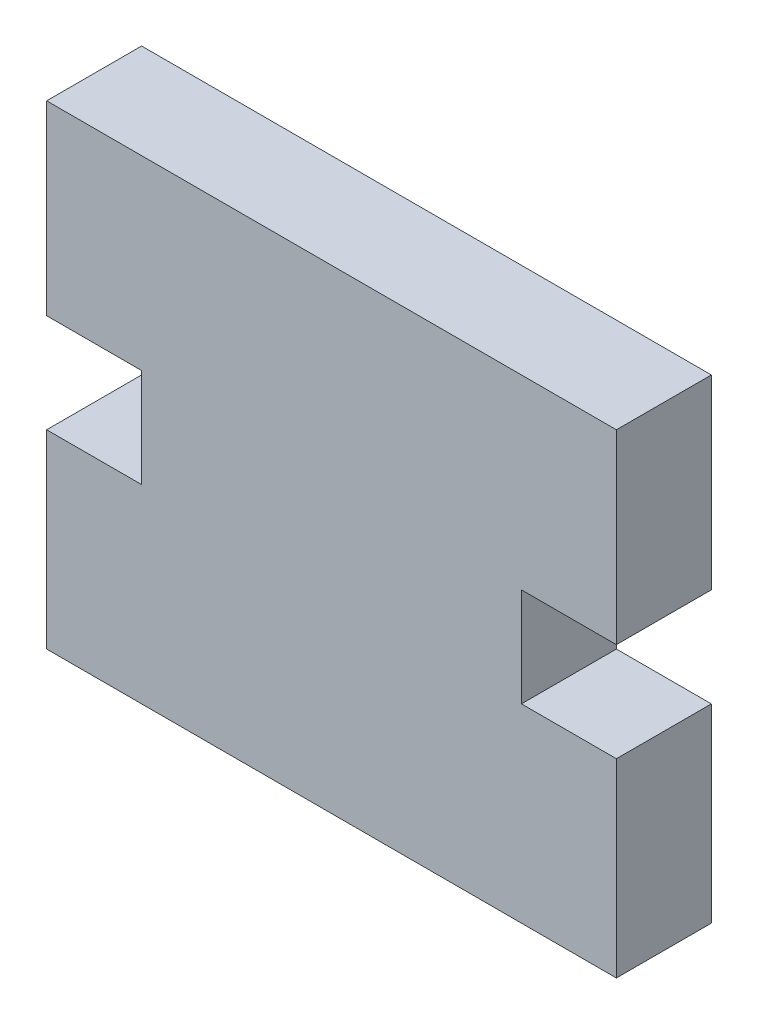
ISO-10303-21;
HEADER;
FILE_DESCRIPTION(('STEP AP214'),'2;1');
FILE_NAME('part.step','',(''),(''),'','','');
FILE_SCHEMA(('AUTOMOTIVE_DESIGN { 1 0 10303 214 1 1 1 1 }'));
ENDSEC;
DATA;
#1=APPLICATION_CONTEXT('core data for automotive mechanical design processes');
#2=APPLICATION_PROTOCOL_DEFINITION('international standard','automotive_design',2000,#1);
#3=PRODUCT_CONTEXT('',#1,'mechanical');
#4=PRODUCT('Part','Part','',(#3));
#5=PRODUCT_RELATED_PRODUCT_CATEGORY('part','',(#4));
#6=PRODUCT_DEFINITION_FORMATION('','',#4);
#7=PRODUCT_DEFINITION_CONTEXT('part definition',#1,'design');
#8=PRODUCT_DEFINITION('design','',#6,#7);
#9=PRODUCT_DEFINITION_SHAPE('','',#8);
#10=(LENGTH_UNIT() NAMED_UNIT(*) SI_UNIT(.MILLI.,.METRE.));
#11=(NAMED_UNIT(*) PLANE_ANGLE_UNIT() SI_UNIT($,.RADIAN.));
#12=(NAMED_UNIT(*) SI_UNIT($,.STERADIAN.) SOLID_ANGLE_UNIT());
#13=UNCERTAINTY_MEASURE_WITH_UNIT(LENGTH_MEASURE(1.E-05),#10,'distance_accuracy_value','');
#14=(GEOMETRIC_REPRESENTATION_CONTEXT(3) GLOBAL_UNCERTAINTY_ASSIGNED_CONTEXT((#13)) GLOBAL_UNIT_ASSIGNED_CONTEXT((#10,
#11,#12)) REPRESENTATION_CONTEXT('',''));
#15=CARTESIAN_POINT('',(0.,0.,0.));
#16=DIRECTION('',(0.,0.,1.));
#17=DIRECTION('',(1.,0.,0.));
#18=AXIS2_PLACEMENT_3D('',#15,#16,#17);
#19=CARTESIAN_POINT('',(-15.,12.5,5.));
#20=DIRECTION('',(1.,0.,0.));
#21=DIRECTION('',(0.,1.,0.));
#22=AXIS2_PLACEMENT_3D('',#19,#20,#21);
#23=PLANE('',#22);
#24=DIRECTION('',(0.,-1.,0.));
#25=VECTOR('',#24,1.);
#26=CARTESIAN_POINT('',(-15.,12.5,0.));
#27=LINE('',#26,#25);
#28=CARTESIAN_POINT('',(-15.,12.5,0.));
#29=VERTEX_POINT('',#28);
#30=CARTESIAN_POINT('',(-15.,2.69999999999998,0.));
#31=VERTEX_POINT('',#30);
#32=EDGE_CURVE('E152',#29,#31,#27,.T.);
#33=ORIENTED_EDGE('',*,*,#32,.T.);
#34=DIRECTION('',(0.,0.,-1.));
#35=VECTOR('',#34,1.);
#36=CARTESIAN_POINT('',(-15.,2.69999999999998,5.));
#37=LINE('',#36,#35);
#38=CARTESIAN_POINT('',(-15.,2.69999999999998,5.));
#39=VERTEX_POINT('',#38);
#40=EDGE_CURVE('E11',#39,#31,#37,.T.);
#41=ORIENTED_EDGE('',*,*,#40,.F.);
#42=DIRECTION('',(0.,-1.,0.));
#43=VECTOR('',#42,1.);
#44=CARTESIAN_POINT('',(-15.,12.5,5.));
#45=LINE('',#44,#43);
#46=CARTESIAN_POINT('',(-15.,12.5,5.));
#47=VERTEX_POINT('',#46);
#48=EDGE_CURVE('E174',#47,#39,#45,.T.);
#49=ORIENTED_EDGE('',*,*,#48,.F.);
#50=DIRECTION('',(0.,0.,-1.));
#51=VECTOR('',#50,1.);
#52=CARTESIAN_POINT('',(-15.,12.5,5.));
#53=LINE('',#52,#51);
#54=EDGE_CURVE('E148',#47,#29,#53,.T.);
#55=ORIENTED_EDGE('',*,*,#54,.T.);
#56=EDGE_LOOP('',(#33,#41,#49,#55));
#57=FACE_BOUND('',#56,.T.);
#58=ADVANCED_FACE('F32',(#57),#23,.F.);
#59=CARTESIAN_POINT('',(-9.99999999999999,2.69999999999998,5.));
#60=DIRECTION('',(0.,1.,0.));
#61=DIRECTION('',(-1.,0.,0.));
#62=AXIS2_PLACEMENT_3D('',#59,#60,#61);
#63=PLANE('',#62);
#64=DIRECTION('',(1.,0.,0.));
#65=VECTOR('',#64,1.);
#66=CARTESIAN_POINT('',(-9.99999999999999,2.69999999999998,0.));
#67=LINE('',#66,#65);
#68=CARTESIAN_POINT('',(-9.99999999999999,2.69999999999998,0.));
#69=VERTEX_POINT('',#68);
#70=EDGE_CURVE('E155',#31,#69,#67,.T.);
#71=ORIENTED_EDGE('',*,*,#70,.T.);
#72=DIRECTION('',(0.,0.,-1.));
#73=VECTOR('',#72,1.);
#74=CARTESIAN_POINT('',(-9.99999999999999,2.69999999999998,5.));
#75=LINE('',#74,#73);
#76=CARTESIAN_POINT('',(-9.99999999999999,2.69999999999998,5.));
#77=VERTEX_POINT('',#76);
#78=EDGE_CURVE('E40',#77,#69,#75,.T.);
#79=ORIENTED_EDGE('',*,*,#78,.F.);
#80=DIRECTION('',(1.,0.,0.));
#81=VECTOR('',#80,1.);
#82=CARTESIAN_POINT('',(-9.99999999999999,2.69999999999998,5.));
#83=LINE('',#82,#81);
#84=EDGE_CURVE('E103',#39,#77,#83,.T.);
#85=ORIENTED_EDGE('',*,*,#84,.F.);
#86=ORIENTED_EDGE('',*,*,#40,.T.);
#87=EDGE_LOOP('',(#71,#79,#85,#86));
#88=FACE_BOUND('',#87,.T.);
#89=ADVANCED_FACE('F252',(#88),#63,.F.);
#90=CARTESIAN_POINT('',(-9.99999999999999,2.69999999999998,5.));
#91=DIRECTION('',(1.,0.,0.));
#92=DIRECTION('',(0.,1.,0.));
#93=AXIS2_PLACEMENT_3D('',#90,#91,#92);
#94=PLANE('',#93);
#95=DIRECTION('',(0.,-1.,0.));
#96=VECTOR('',#95,1.);
#97=CARTESIAN_POINT('',(-9.99999999999999,2.69999999999998,0.));
#98=LINE('',#97,#96);
#99=CARTESIAN_POINT('',(-9.99999999999999,-2.50000000000002,0.));
#100=VERTEX_POINT('',#99);
#101=EDGE_CURVE('E157',#69,#100,#98,.T.);
#102=ORIENTED_EDGE('',*,*,#101,.T.);
#103=DIRECTION('',(0.,0.,-1.));
#104=VECTOR('',#103,1.);
#105=CARTESIAN_POINT('',(-9.99999999999999,-2.50000000000002,5.));
#106=LINE('',#105,#104);
#107=CARTESIAN_POINT('',(-9.99999999999999,-2.50000000000002,5.));
#108=VERTEX_POINT('',#107);
#109=EDGE_CURVE('E193',#108,#100,#106,.T.);
#110=ORIENTED_EDGE('',*,*,#109,.F.);
#111=DIRECTION('',(0.,-1.,0.));
#112=VECTOR('',#111,1.);
#113=CARTESIAN_POINT('',(-9.99999999999999,2.69999999999998,5.));
#114=LINE('',#113,#112);
#115=EDGE_CURVE('E201',#77,#108,#114,.T.);
#116=ORIENTED_EDGE('',*,*,#115,.F.);
#117=ORIENTED_EDGE('',*,*,#78,.T.);
#118=EDGE_LOOP('',(#102,#110,#116,#117));
#119=FACE_BOUND('',#118,.T.);
#120=ADVANCED_FACE('F199',(#119),#94,.F.);
#121=CARTESIAN_POINT('',(-9.99999999999999,-2.50000000000002,5.));
#122=DIRECTION('',(0.,-1.,0.));
#123=DIRECTION('',(1.,0.,0.));
#124=AXIS2_PLACEMENT_3D('',#121,#122,#123);
#125=PLANE('',#124);
#126=DIRECTION('',(-1.,0.,0.));
#127=VECTOR('',#126,1.);
#128=CARTESIAN_POINT('',(-9.99999999999999,-2.50000000000002,0.));
#129=LINE('',#128,#127);
#130=CARTESIAN_POINT('',(-15.,-2.50000000000002,0.));
#131=VERTEX_POINT('',#130);
#132=EDGE_CURVE('E159',#100,#131,#129,.T.);
#133=ORIENTED_EDGE('',*,*,#132,.T.);
#134=DIRECTION('',(0.,0.,-1.));
#135=VECTOR('',#134,1.);
#136=CARTESIAN_POINT('',(-15.,-2.50000000000002,5.));
#137=LINE('',#136,#135);
#138=CARTESIAN_POINT('',(-15.,-2.50000000000002,5.));
#139=VERTEX_POINT('',#138);
#140=EDGE_CURVE('E190',#139,#131,#137,.T.);
#141=ORIENTED_EDGE('',*,*,#140,.F.);
#142=DIRECTION('',(-1.,0.,0.));
#143=VECTOR('',#142,1.);
#144=CARTESIAN_POINT('',(-9.99999999999999,-2.50000000000002,5.));
#145=LINE('',#144,#143);
#146=EDGE_CURVE('E219',#108,#139,#145,.T.);
#147=ORIENTED_EDGE('',*,*,#146,.F.);
#148=ORIENTED_EDGE('',*,*,#109,.T.);
#149=EDGE_LOOP('',(#133,#141,#147,#148));
#150=FACE_BOUND('',#149,.T.);
#151=ADVANCED_FACE('F210',(#150),#125,.F.);
#152=CARTESIAN_POINT('',(-15.,-2.50000000000002,5.));
#153=DIRECTION('',(1.,0.,0.));
#154=DIRECTION('',(0.,1.,0.));
#155=AXIS2_PLACEMENT_3D('',#152,#153,#154);
#156=PLANE('',#155);
#157=DIRECTION('',(0.,-1.,0.));
#158=VECTOR('',#157,1.);
#159=CARTESIAN_POINT('',(-15.,-2.50000000000002,0.));
#160=LINE('',#159,#158);
#161=CARTESIAN_POINT('',(-15.,-12.5,0.));
#162=VERTEX_POINT('',#161);
#163=EDGE_CURVE('E161',#131,#162,#160,.T.);
#164=ORIENTED_EDGE('',*,*,#163,.T.);
#165=DIRECTION('',(0.,0.,-1.));
#166=VECTOR('',#165,1.);
#167=CARTESIAN_POINT('',(-15.,-12.5,5.));
#168=LINE('',#167,#166);
#169=CARTESIAN_POINT('',(-15.,-12.5,5.));
#170=VERTEX_POINT('',#169);
#171=EDGE_CURVE('E187',#170,#162,#168,.T.);
#172=ORIENTED_EDGE('',*,*,#171,.F.);
#173=DIRECTION('',(0.,-1.,0.));
#174=VECTOR('',#173,1.);
#175=CARTESIAN_POINT('',(-15.,-2.50000000000002,5.));
#176=LINE('',#175,#174);
#177=EDGE_CURVE('E216',#139,#170,#176,.T.);
#178=ORIENTED_EDGE('',*,*,#177,.F.);
#179=ORIENTED_EDGE('',*,*,#140,.T.);
#180=EDGE_LOOP('',(#164,#172,#178,#179));
#181=FACE_BOUND('',#180,.T.);
#182=ADVANCED_FACE('F214',(#181),#156,.F.);
#183=CARTESIAN_POINT('',(15.,-12.5,5.));
#184=DIRECTION('',(0.,1.,0.));
#185=DIRECTION('',(-1.,0.,0.));
#186=AXIS2_PLACEMENT_3D('',#183,#184,#185);
#187=PLANE('',#186);
#188=DIRECTION('',(1.,0.,0.));
#189=VECTOR('',#188,1.);
#190=CARTESIAN_POINT('',(15.,-12.5,0.));
#191=LINE('',#190,#189);
#192=CARTESIAN_POINT('',(15.,-12.5,0.));
#193=VERTEX_POINT('',#192);
#194=EDGE_CURVE('E163',#162,#193,#191,.T.);
#195=ORIENTED_EDGE('',*,*,#194,.T.);
#196=DIRECTION('',(0.,0.,-1.));
#197=VECTOR('',#196,1.);
#198=CARTESIAN_POINT('',(15.,-12.5,5.));
#199=LINE('',#198,#197);
#200=CARTESIAN_POINT('',(15.,-12.5,5.));
#201=VERTEX_POINT('',#200);
#202=EDGE_CURVE('E184',#201,#193,#199,.T.);
#203=ORIENTED_EDGE('',*,*,#202,.F.);
#204=DIRECTION('',(1.,0.,0.));
#205=VECTOR('',#204,1.);
#206=CARTESIAN_POINT('',(15.,-12.5,5.));
#207=LINE('',#206,#205);
#208=EDGE_CURVE('E218',#170,#201,#207,.T.);
#209=ORIENTED_EDGE('',*,*,#208,.F.);
#210=ORIENTED_EDGE('',*,*,#171,.T.);
#211=EDGE_LOOP('',(#195,#203,#209,#210));
#212=FACE_BOUND('',#211,.T.);
#213=ADVANCED_FACE('F265',(#212),#187,.F.);
#214=CARTESIAN_POINT('',(15.,-2.50000000000002,5.));
#215=DIRECTION('',(-1.,0.,0.));
#216=DIRECTION('',(0.,-1.,0.));
#217=AXIS2_PLACEMENT_3D('',#214,#215,#216);
#218=PLANE('',#217);
#219=DIRECTION('',(0.,1.,0.));
#220=VECTOR('',#219,1.);
#221=CARTESIAN_POINT('',(15.,-2.50000000000002,0.));
#222=LINE('',#221,#220);
#223=CARTESIAN_POINT('',(15.,-2.50000000000002,0.));
#224=VERTEX_POINT('',#223);
#225=EDGE_CURVE('E165',#193,#224,#222,.T.);
#226=ORIENTED_EDGE('',*,*,#225,.T.);
#227=DIRECTION('',(0.,0.,-1.));
#228=VECTOR('',#227,1.);
#229=CARTESIAN_POINT('',(15.,-2.50000000000002,5.));
#230=LINE('',#229,#228);
#231=CARTESIAN_POINT('',(15.,-2.50000000000002,5.));
#232=VERTEX_POINT('',#231);
#233=EDGE_CURVE('E181',#232,#224,#230,.T.);
#234=ORIENTED_EDGE('',*,*,#233,.F.);
#235=DIRECTION('',(0.,1.,0.));
#236=VECTOR('',#235,1.);
#237=CARTESIAN_POINT('',(15.,-2.50000000000002,5.));
#238=LINE('',#237,#236);
#239=EDGE_CURVE('E221',#201,#232,#238,.T.);
#240=ORIENTED_EDGE('',*,*,#239,.F.);
#241=ORIENTED_EDGE('',*,*,#202,.T.);
#242=EDGE_LOOP('',(#226,#234,#240,#241));
#243=FACE_BOUND('',#242,.T.);
#244=ADVANCED_FACE('F268',(#243),#218,.F.);
#245=CARTESIAN_POINT('',(9.99999999999999,-2.50000000000002,5.));
#246=DIRECTION('',(0.,-1.,0.));
#247=DIRECTION('',(1.,0.,0.));
#248=AXIS2_PLACEMENT_3D('',#245,#246,#247);
#249=PLANE('',#248);
#250=DIRECTION('',(-1.,0.,0.));
#251=VECTOR('',#250,1.);
#252=CARTESIAN_POINT('',(9.99999999999999,-2.50000000000002,0.));
#253=LINE('',#252,#251);
#254=CARTESIAN_POINT('',(9.99999999999999,-2.50000000000002,0.));
#255=VERTEX_POINT('',#254);
#256=EDGE_CURVE('E167',#224,#255,#253,.T.);
#257=ORIENTED_EDGE('',*,*,#256,.T.);
#258=DIRECTION('',(0.,0.,-1.));
#259=VECTOR('',#258,1.);
#260=CARTESIAN_POINT('',(9.99999999999999,-2.50000000000002,5.));
#261=LINE('',#260,#259);
#262=CARTESIAN_POINT('',(9.99999999999999,-2.50000000000002,5.));
#263=VERTEX_POINT('',#262);
#264=EDGE_CURVE('E178',#263,#255,#261,.T.);
#265=ORIENTED_EDGE('',*,*,#264,.F.);
#266=DIRECTION('',(-1.,0.,0.));
#267=VECTOR('',#266,1.);
#268=CARTESIAN_POINT('',(9.99999999999999,-2.50000000000002,5.));
#269=LINE('',#268,#267);
#270=EDGE_CURVE('E227',#232,#263,#269,.T.);
#271=ORIENTED_EDGE('',*,*,#270,.F.);
#272=ORIENTED_EDGE('',*,*,#233,.T.);
#273=EDGE_LOOP('',(#257,#265,#271,#272));
#274=FACE_BOUND('',#273,.T.);
#275=ADVANCED_FACE('F233',(#274),#249,.F.);
#276=CARTESIAN_POINT('',(9.99999999999999,2.69999999999998,5.));
#277=DIRECTION('',(-1.,0.,0.));
#278=DIRECTION('',(0.,0.,1.));
#279=AXIS2_PLACEMENT_3D('',#276,#277,#278);
#280=PLANE('',#279);
#281=DIRECTION('',(0.,1.,0.));
#282=VECTOR('',#281,1.);
#283=CARTESIAN_POINT('',(9.99999999999999,2.69999999999998,0.));
#284=LINE('',#283,#282);
#285=CARTESIAN_POINT('',(9.99999999999999,2.69999999999998,0.));
#286=VERTEX_POINT('',#285);
#287=EDGE_CURVE('E169',#255,#286,#284,.T.);
#288=ORIENTED_EDGE('',*,*,#287,.T.);
#289=DIRECTION('',(0.,0.,-1.));
#290=VECTOR('',#289,1.);
#291=CARTESIAN_POINT('',(9.99999999999999,2.69999999999998,5.));
#292=LINE('',#291,#290);
#293=CARTESIAN_POINT('',(9.99999999999999,2.69999999999998,5.));
#294=VERTEX_POINT('',#293);
#295=EDGE_CURVE('E143',#294,#286,#292,.T.);
#296=ORIENTED_EDGE('',*,*,#295,.F.);
#297=DIRECTION('',(0.,1.,0.));
#298=VECTOR('',#297,1.);
#299=CARTESIAN_POINT('',(9.99999999999999,2.69999999999998,5.));
#300=LINE('',#299,#298);
#301=EDGE_CURVE('E134',#263,#294,#300,.T.);
#302=ORIENTED_EDGE('',*,*,#301,.F.);
#303=ORIENTED_EDGE('',*,*,#264,.T.);
#304=EDGE_LOOP('',(#288,#296,#302,#303));
#305=FACE_BOUND('',#304,.T.);
#306=ADVANCED_FACE('F237',(#305),#280,.F.);
#307=CARTESIAN_POINT('',(9.99999999999999,2.69999999999998,5.));
#308=DIRECTION('',(0.,1.,0.));
#309=DIRECTION('',(-1.,0.,0.));
#310=AXIS2_PLACEMENT_3D('',#307,#308,#309);
#311=PLANE('',#310);
#312=DIRECTION('',(1.,0.,0.));
#313=VECTOR('',#312,1.);
#314=CARTESIAN_POINT('',(9.99999999999999,2.69999999999998,0.));
#315=LINE('',#314,#313);
#316=CARTESIAN_POINT('',(15.,2.69999999999998,0.));
#317=VERTEX_POINT('',#316);
#318=EDGE_CURVE('E142',#286,#317,#315,.T.);
#319=ORIENTED_EDGE('',*,*,#318,.T.);
#320=DIRECTION('',(0.,0.,-1.));
#321=VECTOR('',#320,1.);
#322=CARTESIAN_POINT('',(15.,2.69999999999998,5.));
#323=LINE('',#322,#321);
#324=CARTESIAN_POINT('',(15.,2.69999999999998,5.));
#325=VERTEX_POINT('',#324);
#326=EDGE_CURVE('E139',#325,#317,#323,.T.);
#327=ORIENTED_EDGE('',*,*,#326,.F.);
#328=DIRECTION('',(1.,0.,0.));
#329=VECTOR('',#328,1.);
#330=CARTESIAN_POINT('',(9.99999999999999,2.69999999999998,5.));
#331=LINE('',#330,#329);
#332=EDGE_CURVE('E128',#294,#325,#331,.T.);
#333=ORIENTED_EDGE('',*,*,#332,.F.);
#334=ORIENTED_EDGE('',*,*,#295,.T.);
#335=EDGE_LOOP('',(#319,#327,#333,#334));
#336=FACE_BOUND('',#335,.T.);
#337=ADVANCED_FACE('F140',(#336),#311,.F.);
#338=CARTESIAN_POINT('',(15.,12.5,5.));
#339=DIRECTION('',(-1.,0.,0.));
#340=DIRECTION('',(0.,-1.,0.));
#341=AXIS2_PLACEMENT_3D('',#338,#339,#340);
#342=PLANE('',#341);
#343=DIRECTION('',(0.,1.,0.));
#344=VECTOR('',#343,1.);
#345=CARTESIAN_POINT('',(15.,12.5,0.));
#346=LINE('',#345,#344);
#347=CARTESIAN_POINT('',(15.,12.5,0.));
#348=VERTEX_POINT('',#347);
#349=EDGE_CURVE('E89',#317,#348,#346,.T.);
#350=ORIENTED_EDGE('',*,*,#349,.T.);
#351=DIRECTION('',(0.,0.,-1.));
#352=VECTOR('',#351,1.);
#353=CARTESIAN_POINT('',(15.,12.5,5.));
#354=LINE('',#353,#352);
#355=CARTESIAN_POINT('',(15.,12.5,5.));
#356=VERTEX_POINT('',#355);
#357=EDGE_CURVE('E144',#356,#348,#354,.T.);
#358=ORIENTED_EDGE('',*,*,#357,.F.);
#359=DIRECTION('',(0.,1.,0.));
#360=VECTOR('',#359,1.);
#361=CARTESIAN_POINT('',(15.,12.5,5.));
#362=LINE('',#361,#360);
#363=EDGE_CURVE('E132',#325,#356,#362,.T.);
#364=ORIENTED_EDGE('',*,*,#363,.F.);
#365=ORIENTED_EDGE('',*,*,#326,.T.);
#366=EDGE_LOOP('',(#350,#358,#364,#365));
#367=FACE_BOUND('',#366,.T.);
#368=ADVANCED_FACE('F146',(#367),#342,.F.);
#369=CARTESIAN_POINT('',(15.,12.5,5.));
#370=DIRECTION('',(0.,-1.,0.));
#371=DIRECTION('',(1.,0.,0.));
#372=AXIS2_PLACEMENT_3D('',#369,#370,#371);
#373=PLANE('',#372);
#374=DIRECTION('',(-1.,0.,0.));
#375=VECTOR('',#374,1.);
#376=CARTESIAN_POINT('',(15.,12.5,0.));
#377=LINE('',#376,#375);
#378=EDGE_CURVE('E95',#348,#29,#377,.T.);
#379=ORIENTED_EDGE('',*,*,#378,.T.);
#380=ORIENTED_EDGE('',*,*,#54,.F.);
#381=DIRECTION('',(-1.,0.,0.));
#382=VECTOR('',#381,1.);
#383=CARTESIAN_POINT('',(15.,12.5,5.));
#384=LINE('',#383,#382);
#385=EDGE_CURVE('E48',#356,#47,#384,.T.);
#386=ORIENTED_EDGE('',*,*,#385,.F.);
#387=ORIENTED_EDGE('',*,*,#357,.T.);
#388=EDGE_LOOP('',(#379,#380,#386,#387));
#389=FACE_BOUND('',#388,.T.);
#390=ADVANCED_FACE('F241',(#389),#373,.F.);
#391=CARTESIAN_POINT('',(0.,0.,5.));
#392=DIRECTION('',(0.,0.,-1.));
#393=DIRECTION('',(-1.,0.,0.));
#394=AXIS2_PLACEMENT_3D('',#391,#392,#393);
#395=PLANE('',#394);
#396=ORIENTED_EDGE('',*,*,#48,.T.);
#397=ORIENTED_EDGE('',*,*,#84,.T.);
#398=ORIENTED_EDGE('',*,*,#115,.T.);
#399=ORIENTED_EDGE('',*,*,#146,.T.);
#400=ORIENTED_EDGE('',*,*,#177,.T.);
#401=ORIENTED_EDGE('',*,*,#208,.T.);
#402=ORIENTED_EDGE('',*,*,#239,.T.);
#403=ORIENTED_EDGE('',*,*,#270,.T.);
#404=ORIENTED_EDGE('',*,*,#301,.T.);
#405=ORIENTED_EDGE('',*,*,#332,.T.);
#406=ORIENTED_EDGE('',*,*,#363,.T.);
#407=ORIENTED_EDGE('',*,*,#385,.T.);
#408=EDGE_LOOP('',(#396,#397,#398,#399,#400,#401,#402,#403,#404,#405,#406,#407));
#409=FACE_BOUND('',#408,.T.);
#410=ADVANCED_FACE('F130',(#409),#395,.F.);
#411=CARTESIAN_POINT('',(0.,0.,0.));
#412=DIRECTION('',(0.,0.,-1.));
#413=DIRECTION('',(-1.,0.,0.));
#414=AXIS2_PLACEMENT_3D('',#411,#412,#413);
#415=PLANE('',#414);
#416=ORIENTED_EDGE('',*,*,#32,.F.);
#417=ORIENTED_EDGE('',*,*,#378,.F.);
#418=ORIENTED_EDGE('',*,*,#349,.F.);
#419=ORIENTED_EDGE('',*,*,#318,.F.);
#420=ORIENTED_EDGE('',*,*,#287,.F.);
#421=ORIENTED_EDGE('',*,*,#256,.F.);
#422=ORIENTED_EDGE('',*,*,#225,.F.);
#423=ORIENTED_EDGE('',*,*,#194,.F.);
#424=ORIENTED_EDGE('',*,*,#163,.F.);
#425=ORIENTED_EDGE('',*,*,#132,.F.);
#426=ORIENTED_EDGE('',*,*,#101,.F.);
#427=ORIENTED_EDGE('',*,*,#70,.F.);
#428=EDGE_LOOP('',(#416,#417,#418,#419,#420,#421,#422,#423,#424,#425,#426,#427));
#429=FACE_BOUND('',#428,.T.);
#430=ADVANCED_FACE('F205',(#429),#415,.T.);
#431=CLOSED_SHELL('',(#58,#89,#120,#151,#182,#213,#244,#275,#306,#337,#368,#390,#410,#430));
#432=MANIFOLD_SOLID_BREP('B2',#431);
#433=ADVANCED_BREP_SHAPE_REPRESENTATION('',(#18,#432),#14);
#434=SHAPE_DEFINITION_REPRESENTATION(#9,#433);
ENDSEC;
END-ISO-10303-21;
